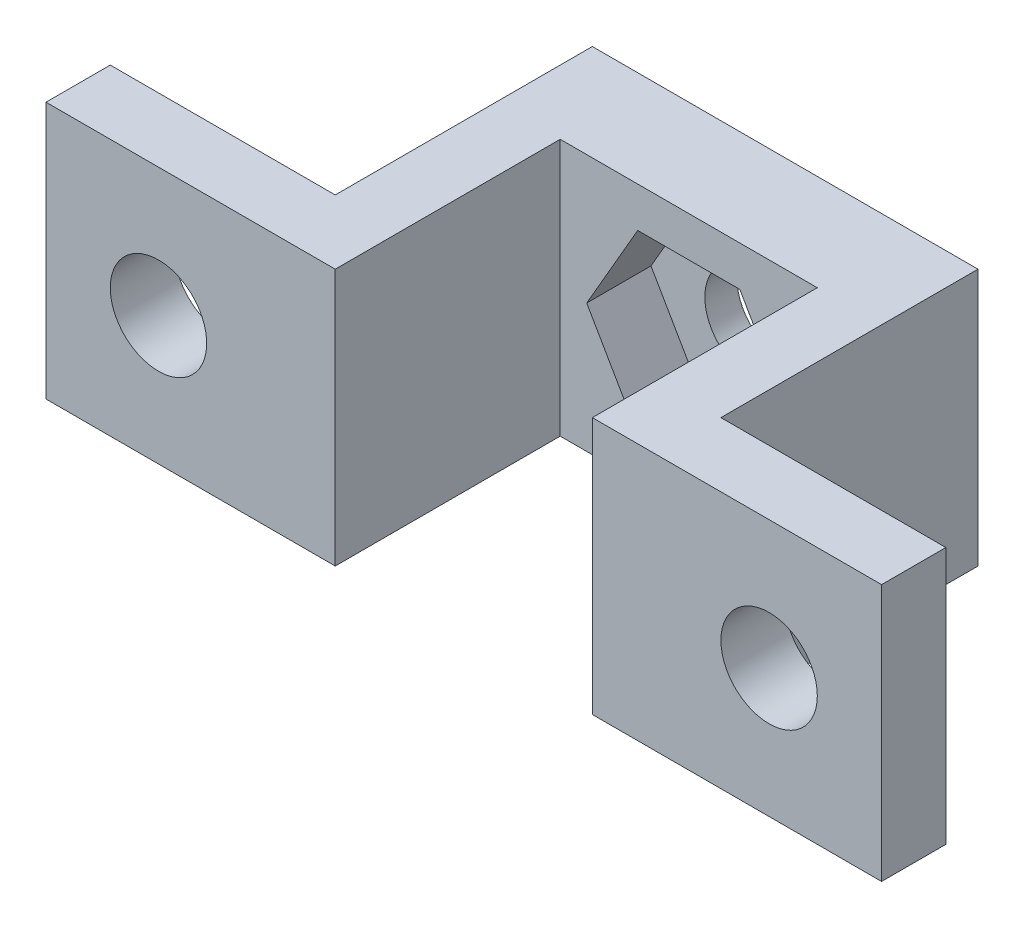
ISO-10303-21;
HEADER;
FILE_DESCRIPTION(('STEP AP214'),'2;1');
FILE_NAME('part.step','',(''),(''),'','','');
FILE_SCHEMA(('AUTOMOTIVE_DESIGN { 1 0 10303 214 1 1 1 1 }'));
ENDSEC;
DATA;
#1=APPLICATION_CONTEXT('core data for automotive mechanical design processes');
#2=APPLICATION_PROTOCOL_DEFINITION('international standard','automotive_design',2000,#1);
#3=PRODUCT_CONTEXT('',#1,'mechanical');
#4=PRODUCT('Part','Part','',(#3));
#5=PRODUCT_RELATED_PRODUCT_CATEGORY('part','',(#4));
#6=PRODUCT_DEFINITION_FORMATION('','',#4);
#7=PRODUCT_DEFINITION_CONTEXT('part definition',#1,'design');
#8=PRODUCT_DEFINITION('design','',#6,#7);
#9=PRODUCT_DEFINITION_SHAPE('','',#8);
#10=(LENGTH_UNIT() NAMED_UNIT(*) SI_UNIT(.MILLI.,.METRE.));
#11=(NAMED_UNIT(*) PLANE_ANGLE_UNIT() SI_UNIT($,.RADIAN.));
#12=(NAMED_UNIT(*) SI_UNIT($,.STERADIAN.) SOLID_ANGLE_UNIT());
#13=UNCERTAINTY_MEASURE_WITH_UNIT(LENGTH_MEASURE(1.E-05),#10,'distance_accuracy_value','');
#14=(GEOMETRIC_REPRESENTATION_CONTEXT(3) GLOBAL_UNCERTAINTY_ASSIGNED_CONTEXT((#13)) GLOBAL_UNIT_ASSIGNED_CONTEXT((#10,
#11,#12)) REPRESENTATION_CONTEXT('',''));
#15=CARTESIAN_POINT('',(0.,0.,0.));
#16=DIRECTION('',(0.,0.,1.));
#17=DIRECTION('',(1.,0.,0.));
#18=AXIS2_PLACEMENT_3D('',#15,#16,#17);
#19=CARTESIAN_POINT('',(-2.,8.,0.));
#20=DIRECTION('',(-1.,0.,0.));
#21=DIRECTION('',(0.,-1.,0.));
#22=AXIS2_PLACEMENT_3D('',#19,#20,#21);
#23=PLANE('',#22);
#24=DIRECTION('',(0.,0.,1.));
#25=VECTOR('',#24,1.);
#26=CARTESIAN_POINT('',(-2.,0.,0.));
#27=LINE('',#26,#25);
#28=CARTESIAN_POINT('',(-2.,0.,0.));
#29=VERTEX_POINT('',#28);
#30=CARTESIAN_POINT('',(-2.,0.,8.));
#31=VERTEX_POINT('',#30);
#32=EDGE_CURVE('E245',#29,#31,#27,.T.);
#33=ORIENTED_EDGE('',*,*,#32,.T.);
#34=DIRECTION('',(0.,1.,0.));
#35=VECTOR('',#34,1.);
#36=CARTESIAN_POINT('',(-2.,0.,8.));
#37=LINE('',#36,#35);
#38=CARTESIAN_POINT('',(-2.,8.,8.));
#39=VERTEX_POINT('',#38);
#40=EDGE_CURVE('E207',#31,#39,#37,.T.);
#41=ORIENTED_EDGE('',*,*,#40,.T.);
#42=DIRECTION('',(0.,0.,1.));
#43=VECTOR('',#42,1.);
#44=CARTESIAN_POINT('',(-2.,8.,0.));
#45=LINE('',#44,#43);
#46=CARTESIAN_POINT('',(-2.,8.,0.));
#47=VERTEX_POINT('',#46);
#48=EDGE_CURVE('E248',#47,#39,#45,.T.);
#49=ORIENTED_EDGE('',*,*,#48,.F.);
#50=DIRECTION('',(0.,-1.,0.));
#51=VECTOR('',#50,1.);
#52=CARTESIAN_POINT('',(-2.,8.,0.));
#53=LINE('',#52,#51);
#54=EDGE_CURVE('E238',#47,#29,#53,.T.);
#55=ORIENTED_EDGE('',*,*,#54,.T.);
#56=EDGE_LOOP('',(#33,#41,#49,#55));
#57=FACE_BOUND('',#56,.T.);
#58=ADVANCED_FACE('F35',(#57),#23,.T.);
#59=CARTESIAN_POINT('',(0.,0.,3.));
#60=DIRECTION('',(0.,1.,0.));
#61=DIRECTION('',(0.,0.,1.));
#62=AXIS2_PLACEMENT_3D('',#59,#60,#61);
#63=PLANE('',#62);
#64=DIRECTION('',(1.,0.,0.));
#65=VECTOR('',#64,1.);
#66=CARTESIAN_POINT('',(0.,0.,0.));
#67=LINE('',#66,#65);
#68=CARTESIAN_POINT('',(10.,0.,0.));
#69=VERTEX_POINT('',#68);
#70=EDGE_CURVE('E289',#29,#69,#67,.T.);
#71=ORIENTED_EDGE('',*,*,#70,.T.);
#72=DIRECTION('',(0.,0.,1.));
#73=VECTOR('',#72,1.);
#74=CARTESIAN_POINT('',(10.,0.,0.));
#75=LINE('',#74,#73);
#76=CARTESIAN_POINT('',(10.,0.,8.));
#77=VERTEX_POINT('',#76);
#78=EDGE_CURVE('E228',#69,#77,#75,.T.);
#79=ORIENTED_EDGE('',*,*,#78,.T.);
#80=DIRECTION('',(-1.,0.,0.));
#81=VECTOR('',#80,1.);
#82=CARTESIAN_POINT('',(10.,0.,8.));
#83=LINE('',#82,#81);
#84=CARTESIAN_POINT('',(17.,0.,8.));
#85=VERTEX_POINT('',#84);
#86=EDGE_CURVE('E185',#85,#77,#83,.T.);
#87=ORIENTED_EDGE('',*,*,#86,.F.);
#88=DIRECTION('',(0.,0.,-1.));
#89=VECTOR('',#88,1.);
#90=CARTESIAN_POINT('',(17.,0.,10.));
#91=LINE('',#90,#89);
#92=CARTESIAN_POINT('',(17.,0.,10.));
#93=VERTEX_POINT('',#92);
#94=EDGE_CURVE('E180',#93,#85,#91,.T.);
#95=ORIENTED_EDGE('',*,*,#94,.F.);
#96=DIRECTION('',(1.,0.,0.));
#97=VECTOR('',#96,1.);
#98=CARTESIAN_POINT('',(8.,0.,10.));
#99=LINE('',#98,#97);
#100=CARTESIAN_POINT('',(8.,0.,10.));
#101=VERTEX_POINT('',#100);
#102=EDGE_CURVE('E164',#101,#93,#99,.T.);
#103=ORIENTED_EDGE('',*,*,#102,.F.);
#104=DIRECTION('',(0.,0.,1.));
#105=VECTOR('',#104,1.);
#106=CARTESIAN_POINT('',(8.,0.,0.));
#107=LINE('',#106,#105);
#108=CARTESIAN_POINT('',(8.,0.,3.));
#109=VERTEX_POINT('',#108);
#110=EDGE_CURVE('E222',#109,#101,#107,.T.);
#111=ORIENTED_EDGE('',*,*,#110,.F.);
#112=DIRECTION('',(1.,0.,0.));
#113=VECTOR('',#112,1.);
#114=CARTESIAN_POINT('',(0.,0.,3.));
#115=LINE('',#114,#113);
#116=CARTESIAN_POINT('',(0.,0.,3.));
#117=VERTEX_POINT('',#116);
#118=EDGE_CURVE('E303',#117,#109,#115,.T.);
#119=ORIENTED_EDGE('',*,*,#118,.F.);
#120=DIRECTION('',(0.,0.,1.));
#121=VECTOR('',#120,1.);
#122=CARTESIAN_POINT('',(0.,0.,0.));
#123=LINE('',#122,#121);
#124=CARTESIAN_POINT('',(0.,0.,10.));
#125=VERTEX_POINT('',#124);
#126=EDGE_CURVE('E242',#117,#125,#123,.T.);
#127=ORIENTED_EDGE('',*,*,#126,.T.);
#128=DIRECTION('',(1.,0.,0.));
#129=VECTOR('',#128,1.);
#130=CARTESIAN_POINT('',(0.,0.,10.));
#131=LINE('',#130,#129);
#132=CARTESIAN_POINT('',(-9.,0.,10.));
#133=VERTEX_POINT('',#132);
#134=EDGE_CURVE('E235',#133,#125,#131,.T.);
#135=ORIENTED_EDGE('',*,*,#134,.F.);
#136=DIRECTION('',(0.,0.,1.));
#137=VECTOR('',#136,1.);
#138=CARTESIAN_POINT('',(-9.,0.,10.));
#139=LINE('',#138,#137);
#140=CARTESIAN_POINT('',(-9.,0.,8.));
#141=VERTEX_POINT('',#140);
#142=EDGE_CURVE('E203',#141,#133,#139,.T.);
#143=ORIENTED_EDGE('',*,*,#142,.F.);
#144=DIRECTION('',(-1.,0.,0.));
#145=VECTOR('',#144,1.);
#146=CARTESIAN_POINT('',(-2.,0.,8.));
#147=LINE('',#146,#145);
#148=EDGE_CURVE('E200',#31,#141,#147,.T.);
#149=ORIENTED_EDGE('',*,*,#148,.F.);
#150=ORIENTED_EDGE('',*,*,#32,.F.);
#151=EDGE_LOOP('',(#71,#79,#87,#95,#103,#111,#119,#127,#135,#143,#149,#150));
#152=FACE_BOUND('',#151,.T.);
#153=ADVANCED_FACE('F37',(#152),#63,.F.);
#154=CARTESIAN_POINT('',(0.,8.,3.));
#155=DIRECTION('',(0.,-1.,0.));
#156=DIRECTION('',(0.,0.,-1.));
#157=AXIS2_PLACEMENT_3D('',#154,#155,#156);
#158=PLANE('',#157);
#159=DIRECTION('',(-1.,0.,0.));
#160=VECTOR('',#159,1.);
#161=CARTESIAN_POINT('',(0.,8.,0.));
#162=LINE('',#161,#160);
#163=CARTESIAN_POINT('',(10.,8.,0.));
#164=VERTEX_POINT('',#163);
#165=EDGE_CURVE('E39',#164,#47,#162,.T.);
#166=ORIENTED_EDGE('',*,*,#165,.T.);
#167=ORIENTED_EDGE('',*,*,#48,.T.);
#168=DIRECTION('',(-1.,0.,0.));
#169=VECTOR('',#168,1.);
#170=CARTESIAN_POINT('',(-2.,8.,8.));
#171=LINE('',#170,#169);
#172=CARTESIAN_POINT('',(-9.,8.,8.));
#173=VERTEX_POINT('',#172);
#174=EDGE_CURVE('E60',#39,#173,#171,.T.);
#175=ORIENTED_EDGE('',*,*,#174,.T.);
#176=DIRECTION('',(0.,0.,1.));
#177=VECTOR('',#176,1.);
#178=CARTESIAN_POINT('',(-9.,8.,10.));
#179=LINE('',#178,#177);
#180=CARTESIAN_POINT('',(-9.,8.,10.));
#181=VERTEX_POINT('',#180);
#182=EDGE_CURVE('E204',#173,#181,#179,.T.);
#183=ORIENTED_EDGE('',*,*,#182,.T.);
#184=DIRECTION('',(-1.,0.,0.));
#185=VECTOR('',#184,1.);
#186=CARTESIAN_POINT('',(0.,8.,10.));
#187=LINE('',#186,#185);
#188=CARTESIAN_POINT('',(0.,8.,10.));
#189=VERTEX_POINT('',#188);
#190=EDGE_CURVE('E233',#189,#181,#187,.T.);
#191=ORIENTED_EDGE('',*,*,#190,.F.);
#192=DIRECTION('',(0.,0.,1.));
#193=VECTOR('',#192,1.);
#194=CARTESIAN_POINT('',(0.,8.,0.));
#195=LINE('',#194,#193);
#196=CARTESIAN_POINT('',(0.,8.,3.));
#197=VERTEX_POINT('',#196);
#198=EDGE_CURVE('E241',#197,#189,#195,.T.);
#199=ORIENTED_EDGE('',*,*,#198,.F.);
#200=DIRECTION('',(-1.,0.,0.));
#201=VECTOR('',#200,1.);
#202=CARTESIAN_POINT('',(0.,8.,3.));
#203=LINE('',#202,#201);
#204=CARTESIAN_POINT('',(8.,8.,3.));
#205=VERTEX_POINT('',#204);
#206=EDGE_CURVE('E11',#205,#197,#203,.T.);
#207=ORIENTED_EDGE('',*,*,#206,.F.);
#208=DIRECTION('',(0.,0.,1.));
#209=VECTOR('',#208,1.);
#210=CARTESIAN_POINT('',(8.,8.,0.));
#211=LINE('',#210,#209);
#212=CARTESIAN_POINT('',(8.,8.,10.));
#213=VERTEX_POINT('',#212);
#214=EDGE_CURVE('E223',#205,#213,#211,.T.);
#215=ORIENTED_EDGE('',*,*,#214,.T.);
#216=DIRECTION('',(-1.,0.,0.));
#217=VECTOR('',#216,1.);
#218=CARTESIAN_POINT('',(8.,8.,10.));
#219=LINE('',#218,#217);
#220=CARTESIAN_POINT('',(17.,8.,10.));
#221=VERTEX_POINT('',#220);
#222=EDGE_CURVE('E175',#221,#213,#219,.T.);
#223=ORIENTED_EDGE('',*,*,#222,.F.);
#224=DIRECTION('',(0.,0.,-1.));
#225=VECTOR('',#224,1.);
#226=CARTESIAN_POINT('',(17.,8.,10.));
#227=LINE('',#226,#225);
#228=CARTESIAN_POINT('',(17.,8.,8.));
#229=VERTEX_POINT('',#228);
#230=EDGE_CURVE('E183',#221,#229,#227,.T.);
#231=ORIENTED_EDGE('',*,*,#230,.T.);
#232=DIRECTION('',(-1.,0.,0.));
#233=VECTOR('',#232,1.);
#234=CARTESIAN_POINT('',(10.,8.,8.));
#235=LINE('',#234,#233);
#236=CARTESIAN_POINT('',(10.,8.,8.));
#237=VERTEX_POINT('',#236);
#238=EDGE_CURVE('E188',#229,#237,#235,.T.);
#239=ORIENTED_EDGE('',*,*,#238,.T.);
#240=DIRECTION('',(0.,0.,1.));
#241=VECTOR('',#240,1.);
#242=CARTESIAN_POINT('',(10.,8.,0.));
#243=LINE('',#242,#241);
#244=EDGE_CURVE('E226',#164,#237,#243,.T.);
#245=ORIENTED_EDGE('',*,*,#244,.F.);
#246=EDGE_LOOP('',(#166,#167,#175,#183,#191,#199,#207,#215,#223,#231,#239,#245));
#247=FACE_BOUND('',#246,.T.);
#248=ADVANCED_FACE('F311',(#247),#158,.F.);
#249=CARTESIAN_POINT('',(0.,0.,3.));
#250=DIRECTION('',(0.,0.,-1.));
#251=DIRECTION('',(-1.,0.,0.));
#252=AXIS2_PLACEMENT_3D('',#249,#250,#251);
#253=PLANE('',#252);
#254=DIRECTION('',(-1.,0.,0.));
#255=VECTOR('',#254,1.);
#256=CARTESIAN_POINT('',(5.58771324027147,6.75,3.));
#257=LINE('',#256,#255);
#258=CARTESIAN_POINT('',(5.58771324027147,6.75,3.));
#259=VERTEX_POINT('',#258);
#260=CARTESIAN_POINT('',(2.41228675972853,6.75,3.));
#261=VERTEX_POINT('',#260);
#262=EDGE_CURVE('E273',#259,#261,#257,.T.);
#263=ORIENTED_EDGE('',*,*,#262,.F.);
#264=DIRECTION('',(-0.5,0.866025403784438,0.));
#265=VECTOR('',#264,1.);
#266=CARTESIAN_POINT('',(7.17542648054294,4.,3.));
#267=LINE('',#266,#265);
#268=CARTESIAN_POINT('',(7.17542648054294,4.,3.));
#269=VERTEX_POINT('',#268);
#270=EDGE_CURVE('E244',#269,#259,#267,.T.);
#271=ORIENTED_EDGE('',*,*,#270,.F.);
#272=DIRECTION('',(0.5,0.866025403784439,0.));
#273=VECTOR('',#272,1.);
#274=CARTESIAN_POINT('',(5.58771324027147,1.25,3.));
#275=LINE('',#274,#273);
#276=CARTESIAN_POINT('',(5.58771324027147,1.25,3.));
#277=VERTEX_POINT('',#276);
#278=EDGE_CURVE('E256',#277,#269,#275,.T.);
#279=ORIENTED_EDGE('',*,*,#278,.F.);
#280=DIRECTION('',(1.,0.,0.));
#281=VECTOR('',#280,1.);
#282=CARTESIAN_POINT('',(2.41228675972853,1.25,3.));
#283=LINE('',#282,#281);
#284=CARTESIAN_POINT('',(2.41228675972853,1.25,3.));
#285=VERTEX_POINT('',#284);
#286=EDGE_CURVE('E282',#285,#277,#283,.T.);
#287=ORIENTED_EDGE('',*,*,#286,.F.);
#288=DIRECTION('',(0.5,-0.866025403784438,0.));
#289=VECTOR('',#288,1.);
#290=CARTESIAN_POINT('',(0.824573519457059,4.,3.));
#291=LINE('',#290,#289);
#292=CARTESIAN_POINT('',(0.824573519457059,4.,3.));
#293=VERTEX_POINT('',#292);
#294=EDGE_CURVE('E279',#293,#285,#291,.T.);
#295=ORIENTED_EDGE('',*,*,#294,.F.);
#296=DIRECTION('',(-0.5,-0.866025403784439,0.));
#297=VECTOR('',#296,1.);
#298=CARTESIAN_POINT('',(2.41228675972853,6.75,3.));
#299=LINE('',#298,#297);
#300=EDGE_CURVE('E276',#261,#293,#299,.T.);
#301=ORIENTED_EDGE('',*,*,#300,.F.);
#302=EDGE_LOOP('',(#263,#271,#279,#287,#295,#301));
#303=FACE_BOUND('',#302,.T.);
#304=DIRECTION('',(0.,-1.,0.));
#305=VECTOR('',#304,1.);
#306=CARTESIAN_POINT('',(0.,0.,3.));
#307=LINE('',#306,#305);
#308=EDGE_CURVE('E300',#197,#117,#307,.T.);
#309=ORIENTED_EDGE('',*,*,#308,.T.);
#310=ORIENTED_EDGE('',*,*,#118,.T.);
#311=DIRECTION('',(0.,1.,0.));
#312=VECTOR('',#311,1.);
#313=CARTESIAN_POINT('',(8.,0.,3.));
#314=LINE('',#313,#312);
#315=EDGE_CURVE('E44',#109,#205,#314,.T.);
#316=ORIENTED_EDGE('',*,*,#315,.T.);
#317=ORIENTED_EDGE('',*,*,#206,.T.);
#318=EDGE_LOOP('',(#309,#310,#316,#317));
#319=FACE_BOUND('',#318,.T.);
#320=ADVANCED_FACE('F334',(#303,#319),#253,.F.);
#321=CARTESIAN_POINT('',(0.,0.,0.));
#322=DIRECTION('',(0.,0.,-1.));
#323=DIRECTION('',(-1.,0.,0.));
#324=AXIS2_PLACEMENT_3D('',#321,#322,#323);
#325=PLANE('',#324);
#326=CARTESIAN_POINT('',(4.,4.,0.));
#327=DIRECTION('',(0.,0.,-1.));
#328=DIRECTION('',(-1.,0.,0.));
#329=AXIS2_PLACEMENT_3D('',#326,#327,#328);
#330=CIRCLE('',#329,1.5);
#331=CARTESIAN_POINT('',(2.5,4.,0.));
#332=VERTEX_POINT('',#331);
#333=EDGE_CURVE('E194',#332,#332,#330,.T.);
#334=ORIENTED_EDGE('',*,*,#333,.F.);
#335=EDGE_LOOP('',(#334));
#336=FACE_BOUND('',#335,.T.);
#337=ORIENTED_EDGE('',*,*,#70,.F.);
#338=ORIENTED_EDGE('',*,*,#54,.F.);
#339=ORIENTED_EDGE('',*,*,#165,.F.);
#340=DIRECTION('',(0.,1.,0.));
#341=VECTOR('',#340,1.);
#342=CARTESIAN_POINT('',(10.,8.,0.));
#343=LINE('',#342,#341);
#344=EDGE_CURVE('E219',#69,#164,#343,.T.);
#345=ORIENTED_EDGE('',*,*,#344,.F.);
#346=EDGE_LOOP('',(#337,#338,#339,#345));
#347=FACE_BOUND('',#346,.T.);
#348=ADVANCED_FACE('F316',(#336,#347),#325,.T.);
#349=CARTESIAN_POINT('',(7.17542648054294,4.,1.));
#350=DIRECTION('',(0.866025403784438,0.5,0.));
#351=DIRECTION('',(-0.5,0.866025403784439,0.));
#352=AXIS2_PLACEMENT_3D('',#349,#350,#351);
#353=PLANE('',#352);
#354=ORIENTED_EDGE('',*,*,#270,.T.);
#355=DIRECTION('',(0.,0.,1.));
#356=VECTOR('',#355,1.);
#357=CARTESIAN_POINT('',(5.58771324027147,6.75,1.));
#358=LINE('',#357,#356);
#359=CARTESIAN_POINT('',(5.58771324027147,6.75,1.));
#360=VERTEX_POINT('',#359);
#361=EDGE_CURVE('E271',#360,#259,#358,.T.);
#362=ORIENTED_EDGE('',*,*,#361,.F.);
#363=DIRECTION('',(-0.5,0.866025403784438,0.));
#364=VECTOR('',#363,1.);
#365=CARTESIAN_POINT('',(7.17542648054294,4.,1.));
#366=LINE('',#365,#364);
#367=CARTESIAN_POINT('',(7.17542648054294,4.,1.));
#368=VERTEX_POINT('',#367);
#369=EDGE_CURVE('E252',#368,#360,#366,.T.);
#370=ORIENTED_EDGE('',*,*,#369,.F.);
#371=DIRECTION('',(0.,0.,1.));
#372=VECTOR('',#371,1.);
#373=CARTESIAN_POINT('',(7.17542648054294,4.,1.));
#374=LINE('',#373,#372);
#375=EDGE_CURVE('E287',#368,#269,#374,.T.);
#376=ORIENTED_EDGE('',*,*,#375,.T.);
#377=EDGE_LOOP('',(#354,#362,#370,#376));
#378=FACE_BOUND('',#377,.T.);
#379=ADVANCED_FACE('F364',(#378),#353,.F.);
#380=CARTESIAN_POINT('',(5.58771324027147,1.25,1.));
#381=DIRECTION('',(0.866025403784439,-0.5,0.));
#382=DIRECTION('',(0.5,0.866025403784439,0.));
#383=AXIS2_PLACEMENT_3D('',#380,#381,#382);
#384=PLANE('',#383);
#385=ORIENTED_EDGE('',*,*,#278,.T.);
#386=ORIENTED_EDGE('',*,*,#375,.F.);
#387=DIRECTION('',(0.5,0.866025403784439,0.));
#388=VECTOR('',#387,1.);
#389=CARTESIAN_POINT('',(5.58771324027147,1.25,1.));
#390=LINE('',#389,#388);
#391=CARTESIAN_POINT('',(5.58771324027147,1.25,1.));
#392=VERTEX_POINT('',#391);
#393=EDGE_CURVE('E268',#392,#368,#390,.T.);
#394=ORIENTED_EDGE('',*,*,#393,.F.);
#395=DIRECTION('',(0.,0.,1.));
#396=VECTOR('',#395,1.);
#397=CARTESIAN_POINT('',(5.58771324027147,1.25,1.));
#398=LINE('',#397,#396);
#399=EDGE_CURVE('E290',#392,#277,#398,.T.);
#400=ORIENTED_EDGE('',*,*,#399,.T.);
#401=EDGE_LOOP('',(#385,#386,#394,#400));
#402=FACE_BOUND('',#401,.T.);
#403=ADVANCED_FACE('F360',(#402),#384,.F.);
#404=CARTESIAN_POINT('',(2.41228675972853,1.25,1.));
#405=DIRECTION('',(0.,-1.,0.));
#406=DIRECTION('',(1.,0.,0.));
#407=AXIS2_PLACEMENT_3D('',#404,#405,#406);
#408=PLANE('',#407);
#409=ORIENTED_EDGE('',*,*,#286,.T.);
#410=ORIENTED_EDGE('',*,*,#399,.F.);
#411=DIRECTION('',(1.,0.,0.));
#412=VECTOR('',#411,1.);
#413=CARTESIAN_POINT('',(2.41228675972853,1.25,1.));
#414=LINE('',#413,#412);
#415=CARTESIAN_POINT('',(2.41228675972853,1.25,1.));
#416=VERTEX_POINT('',#415);
#417=EDGE_CURVE('E265',#416,#392,#414,.T.);
#418=ORIENTED_EDGE('',*,*,#417,.F.);
#419=DIRECTION('',(0.,0.,1.));
#420=VECTOR('',#419,1.);
#421=CARTESIAN_POINT('',(2.41228675972853,1.25,1.));
#422=LINE('',#421,#420);
#423=EDGE_CURVE('E292',#416,#285,#422,.T.);
#424=ORIENTED_EDGE('',*,*,#423,.T.);
#425=EDGE_LOOP('',(#409,#410,#418,#424));
#426=FACE_BOUND('',#425,.T.);
#427=ADVANCED_FACE('F363',(#426),#408,.F.);
#428=CARTESIAN_POINT('',(0.824573519457059,4.,1.));
#429=DIRECTION('',(-0.866025403784438,-0.5,0.));
#430=DIRECTION('',(0.5,-0.866025403784439,0.));
#431=AXIS2_PLACEMENT_3D('',#428,#429,#430);
#432=PLANE('',#431);
#433=ORIENTED_EDGE('',*,*,#294,.T.);
#434=ORIENTED_EDGE('',*,*,#423,.F.);
#435=DIRECTION('',(0.5,-0.866025403784438,0.));
#436=VECTOR('',#435,1.);
#437=CARTESIAN_POINT('',(0.824573519457059,4.,1.));
#438=LINE('',#437,#436);
#439=CARTESIAN_POINT('',(0.824573519457059,4.,1.));
#440=VERTEX_POINT('',#439);
#441=EDGE_CURVE('E262',#440,#416,#438,.T.);
#442=ORIENTED_EDGE('',*,*,#441,.F.);
#443=DIRECTION('',(0.,0.,1.));
#444=VECTOR('',#443,1.);
#445=CARTESIAN_POINT('',(0.824573519457059,4.,1.));
#446=LINE('',#445,#444);
#447=EDGE_CURVE('E294',#440,#293,#446,.T.);
#448=ORIENTED_EDGE('',*,*,#447,.T.);
#449=EDGE_LOOP('',(#433,#434,#442,#448));
#450=FACE_BOUND('',#449,.T.);
#451=ADVANCED_FACE('F368',(#450),#432,.F.);
#452=CARTESIAN_POINT('',(2.41228675972853,6.75,1.));
#453=DIRECTION('',(-0.866025403784439,0.5,0.));
#454=DIRECTION('',(-0.5,-0.866025403784439,0.));
#455=AXIS2_PLACEMENT_3D('',#452,#453,#454);
#456=PLANE('',#455);
#457=ORIENTED_EDGE('',*,*,#300,.T.);
#458=ORIENTED_EDGE('',*,*,#447,.F.);
#459=DIRECTION('',(-0.5,-0.866025403784439,0.));
#460=VECTOR('',#459,1.);
#461=CARTESIAN_POINT('',(2.41228675972853,6.75,1.));
#462=LINE('',#461,#460);
#463=CARTESIAN_POINT('',(2.41228675972853,6.75,1.));
#464=VERTEX_POINT('',#463);
#465=EDGE_CURVE('E259',#464,#440,#462,.T.);
#466=ORIENTED_EDGE('',*,*,#465,.F.);
#467=DIRECTION('',(0.,0.,1.));
#468=VECTOR('',#467,1.);
#469=CARTESIAN_POINT('',(2.41228675972853,6.75,1.));
#470=LINE('',#469,#468);
#471=EDGE_CURVE('E296',#464,#261,#470,.T.);
#472=ORIENTED_EDGE('',*,*,#471,.T.);
#473=EDGE_LOOP('',(#457,#458,#466,#472));
#474=FACE_BOUND('',#473,.T.);
#475=ADVANCED_FACE('F372',(#474),#456,.F.);
#476=CARTESIAN_POINT('',(5.58771324027147,6.75,1.));
#477=DIRECTION('',(0.,1.,0.));
#478=DIRECTION('',(0.,0.,1.));
#479=AXIS2_PLACEMENT_3D('',#476,#477,#478);
#480=PLANE('',#479);
#481=ORIENTED_EDGE('',*,*,#262,.T.);
#482=ORIENTED_EDGE('',*,*,#471,.F.);
#483=DIRECTION('',(-1.,0.,0.));
#484=VECTOR('',#483,1.);
#485=CARTESIAN_POINT('',(5.58771324027147,6.75,1.));
#486=LINE('',#485,#484);
#487=EDGE_CURVE('E255',#360,#464,#486,.T.);
#488=ORIENTED_EDGE('',*,*,#487,.F.);
#489=ORIENTED_EDGE('',*,*,#361,.T.);
#490=EDGE_LOOP('',(#481,#482,#488,#489));
#491=FACE_BOUND('',#490,.T.);
#492=ADVANCED_FACE('F358',(#491),#480,.F.);
#493=CARTESIAN_POINT('',(0.,0.,1.));
#494=DIRECTION('',(0.,0.,1.));
#495=DIRECTION('',(1.,0.,0.));
#496=AXIS2_PLACEMENT_3D('',#493,#494,#495);
#497=PLANE('',#496);
#498=CARTESIAN_POINT('',(4.,4.,1.));
#499=DIRECTION('',(0.,0.,1.));
#500=DIRECTION('',(1.,0.,0.));
#501=AXIS2_PLACEMENT_3D('',#498,#499,#500);
#502=CIRCLE('',#501,1.5);
#503=CARTESIAN_POINT('',(5.5,4.,1.));
#504=VERTEX_POINT('',#503);
#505=EDGE_CURVE('E598',#504,#504,#502,.T.);
#506=ORIENTED_EDGE('',*,*,#505,.F.);
#507=EDGE_LOOP('',(#506));
#508=FACE_BOUND('',#507,.T.);
#509=ORIENTED_EDGE('',*,*,#369,.T.);
#510=ORIENTED_EDGE('',*,*,#487,.T.);
#511=ORIENTED_EDGE('',*,*,#465,.T.);
#512=ORIENTED_EDGE('',*,*,#441,.T.);
#513=ORIENTED_EDGE('',*,*,#417,.T.);
#514=ORIENTED_EDGE('',*,*,#393,.T.);
#515=EDGE_LOOP('',(#509,#510,#511,#512,#513,#514));
#516=FACE_BOUND('',#515,.T.);
#517=ADVANCED_FACE('F355',(#508,#516),#497,.T.);
#518=CARTESIAN_POINT('',(0.,8.,0.));
#519=DIRECTION('',(1.,0.,0.));
#520=DIRECTION('',(0.,1.,0.));
#521=AXIS2_PLACEMENT_3D('',#518,#519,#520);
#522=PLANE('',#521);
#523=ORIENTED_EDGE('',*,*,#308,.F.);
#524=ORIENTED_EDGE('',*,*,#198,.T.);
#525=DIRECTION('',(0.,1.,0.));
#526=VECTOR('',#525,1.);
#527=CARTESIAN_POINT('',(0.,8.,10.));
#528=LINE('',#527,#526);
#529=EDGE_CURVE('E225',#125,#189,#528,.T.);
#530=ORIENTED_EDGE('',*,*,#529,.F.);
#531=ORIENTED_EDGE('',*,*,#126,.F.);
#532=EDGE_LOOP('',(#523,#524,#530,#531));
#533=FACE_BOUND('',#532,.T.);
#534=ADVANCED_FACE('F331',(#533),#522,.T.);
#535=CARTESIAN_POINT('',(0.,0.,10.));
#536=DIRECTION('',(0.,0.,-1.));
#537=DIRECTION('',(-1.,0.,0.));
#538=AXIS2_PLACEMENT_3D('',#535,#536,#537);
#539=PLANE('',#538);
#540=CARTESIAN_POINT('',(-5.5,4.,10.));
#541=DIRECTION('',(0.,0.,-1.));
#542=DIRECTION('',(-1.,0.,0.));
#543=AXIS2_PLACEMENT_3D('',#540,#541,#542);
#544=CIRCLE('',#543,1.5);
#545=CARTESIAN_POINT('',(-7.,4.,10.));
#546=VERTEX_POINT('',#545);
#547=EDGE_CURVE('E606',#546,#546,#544,.T.);
#548=ORIENTED_EDGE('',*,*,#547,.T.);
#549=EDGE_LOOP('',(#548));
#550=FACE_BOUND('',#549,.T.);
#551=ORIENTED_EDGE('',*,*,#529,.T.);
#552=ORIENTED_EDGE('',*,*,#190,.T.);
#553=DIRECTION('',(0.,1.,0.));
#554=VECTOR('',#553,1.);
#555=CARTESIAN_POINT('',(-9.,0.,10.));
#556=LINE('',#555,#554);
#557=EDGE_CURVE('E211',#133,#181,#556,.T.);
#558=ORIENTED_EDGE('',*,*,#557,.F.);
#559=ORIENTED_EDGE('',*,*,#134,.T.);
#560=EDGE_LOOP('',(#551,#552,#558,#559));
#561=FACE_BOUND('',#560,.T.);
#562=ADVANCED_FACE('F329',(#550,#561),#539,.F.);
#563=CARTESIAN_POINT('',(8.,8.,0.));
#564=DIRECTION('',(-1.,0.,0.));
#565=DIRECTION('',(0.,-1.,0.));
#566=AXIS2_PLACEMENT_3D('',#563,#564,#565);
#567=PLANE('',#566);
#568=ORIENTED_EDGE('',*,*,#315,.F.);
#569=ORIENTED_EDGE('',*,*,#110,.T.);
#570=DIRECTION('',(0.,-1.,0.));
#571=VECTOR('',#570,1.);
#572=CARTESIAN_POINT('',(8.,8.,10.));
#573=LINE('',#572,#571);
#574=EDGE_CURVE('E171',#213,#101,#573,.T.);
#575=ORIENTED_EDGE('',*,*,#574,.F.);
#576=ORIENTED_EDGE('',*,*,#214,.F.);
#577=EDGE_LOOP('',(#568,#569,#575,#576));
#578=FACE_BOUND('',#577,.T.);
#579=ADVANCED_FACE('F336',(#578),#567,.T.);
#580=CARTESIAN_POINT('',(10.,8.,0.));
#581=DIRECTION('',(1.,0.,0.));
#582=DIRECTION('',(0.,1.,0.));
#583=AXIS2_PLACEMENT_3D('',#580,#581,#582);
#584=PLANE('',#583);
#585=DIRECTION('',(0.,1.,0.));
#586=VECTOR('',#585,1.);
#587=CARTESIAN_POINT('',(10.,0.,8.));
#588=LINE('',#587,#586);
#589=EDGE_CURVE('E52',#77,#237,#588,.T.);
#590=ORIENTED_EDGE('',*,*,#589,.F.);
#591=ORIENTED_EDGE('',*,*,#78,.F.);
#592=ORIENTED_EDGE('',*,*,#344,.T.);
#593=ORIENTED_EDGE('',*,*,#244,.T.);
#594=EDGE_LOOP('',(#590,#591,#592,#593));
#595=FACE_BOUND('',#594,.T.);
#596=ADVANCED_FACE('F338',(#595),#584,.T.);
#597=CARTESIAN_POINT('',(0.,0.,10.));
#598=DIRECTION('',(0.,0.,1.));
#599=DIRECTION('',(1.,0.,0.));
#600=AXIS2_PLACEMENT_3D('',#597,#598,#599);
#601=PLANE('',#600);
#602=CARTESIAN_POINT('',(13.5,4.,10.));
#603=DIRECTION('',(0.,0.,1.));
#604=DIRECTION('',(1.,0.,0.));
#605=AXIS2_PLACEMENT_3D('',#602,#603,#604);
#606=CIRCLE('',#605,1.5);
#607=CARTESIAN_POINT('',(15.,4.,10.));
#608=VERTEX_POINT('',#607);
#609=EDGE_CURVE('E599',#608,#608,#606,.T.);
#610=ORIENTED_EDGE('',*,*,#609,.F.);
#611=EDGE_LOOP('',(#610));
#612=FACE_BOUND('',#611,.T.);
#613=ORIENTED_EDGE('',*,*,#574,.T.);
#614=ORIENTED_EDGE('',*,*,#102,.T.);
#615=DIRECTION('',(0.,1.,0.));
#616=VECTOR('',#615,1.);
#617=CARTESIAN_POINT('',(17.,0.,10.));
#618=LINE('',#617,#616);
#619=EDGE_CURVE('E168',#93,#221,#618,.T.);
#620=ORIENTED_EDGE('',*,*,#619,.T.);
#621=ORIENTED_EDGE('',*,*,#222,.T.);
#622=EDGE_LOOP('',(#613,#614,#620,#621));
#623=FACE_BOUND('',#622,.T.);
#624=ADVANCED_FACE('F166',(#612,#623),#601,.T.);
#625=CARTESIAN_POINT('',(-9.,0.,10.));
#626=DIRECTION('',(-1.,0.,0.));
#627=DIRECTION('',(0.,0.,1.));
#628=AXIS2_PLACEMENT_3D('',#625,#626,#627);
#629=PLANE('',#628);
#630=ORIENTED_EDGE('',*,*,#182,.F.);
#631=DIRECTION('',(0.,1.,0.));
#632=VECTOR('',#631,1.);
#633=CARTESIAN_POINT('',(-9.,0.,8.));
#634=LINE('',#633,#632);
#635=EDGE_CURVE('E214',#141,#173,#634,.T.);
#636=ORIENTED_EDGE('',*,*,#635,.F.);
#637=ORIENTED_EDGE('',*,*,#142,.T.);
#638=ORIENTED_EDGE('',*,*,#557,.T.);
#639=EDGE_LOOP('',(#630,#636,#637,#638));
#640=FACE_BOUND('',#639,.T.);
#641=ADVANCED_FACE('F322',(#640),#629,.T.);
#642=CARTESIAN_POINT('',(-2.,0.,8.));
#643=DIRECTION('',(0.,0.,-1.));
#644=DIRECTION('',(-1.,0.,0.));
#645=AXIS2_PLACEMENT_3D('',#642,#643,#644);
#646=PLANE('',#645);
#647=CARTESIAN_POINT('',(-5.5,4.,8.));
#648=DIRECTION('',(0.,0.,-1.));
#649=DIRECTION('',(1.,0.,0.));
#650=AXIS2_PLACEMENT_3D('',#647,#648,#649);
#651=CIRCLE('',#650,1.5);
#652=CARTESIAN_POINT('',(-4.,4.,8.));
#653=VERTEX_POINT('',#652);
#654=EDGE_CURVE('E609',#653,#653,#651,.T.);
#655=ORIENTED_EDGE('',*,*,#654,.F.);
#656=EDGE_LOOP('',(#655));
#657=FACE_BOUND('',#656,.T.);
#658=ORIENTED_EDGE('',*,*,#174,.F.);
#659=ORIENTED_EDGE('',*,*,#40,.F.);
#660=ORIENTED_EDGE('',*,*,#148,.T.);
#661=ORIENTED_EDGE('',*,*,#635,.T.);
#662=EDGE_LOOP('',(#658,#659,#660,#661));
#663=FACE_BOUND('',#662,.T.);
#664=ADVANCED_FACE('F319',(#657,#663),#646,.T.);
#665=CARTESIAN_POINT('',(10.,0.,8.));
#666=DIRECTION('',(0.,0.,-1.));
#667=DIRECTION('',(-1.,0.,0.));
#668=AXIS2_PLACEMENT_3D('',#665,#666,#667);
#669=PLANE('',#668);
#670=CARTESIAN_POINT('',(13.5,4.,8.));
#671=DIRECTION('',(0.,0.,-1.));
#672=DIRECTION('',(-1.,0.,0.));
#673=AXIS2_PLACEMENT_3D('',#670,#671,#672);
#674=CIRCLE('',#673,1.5);
#675=CARTESIAN_POINT('',(12.,4.,8.));
#676=VERTEX_POINT('',#675);
#677=EDGE_CURVE('E601',#676,#676,#674,.T.);
#678=ORIENTED_EDGE('',*,*,#677,.F.);
#679=EDGE_LOOP('',(#678));
#680=FACE_BOUND('',#679,.T.);
#681=ORIENTED_EDGE('',*,*,#238,.F.);
#682=DIRECTION('',(0.,1.,0.));
#683=VECTOR('',#682,1.);
#684=CARTESIAN_POINT('',(17.,0.,8.));
#685=LINE('',#684,#683);
#686=EDGE_CURVE('E184',#85,#229,#685,.T.);
#687=ORIENTED_EDGE('',*,*,#686,.F.);
#688=ORIENTED_EDGE('',*,*,#86,.T.);
#689=ORIENTED_EDGE('',*,*,#589,.T.);
#690=EDGE_LOOP('',(#681,#687,#688,#689));
#691=FACE_BOUND('',#690,.T.);
#692=ADVANCED_FACE('F466',(#680,#691),#669,.T.);
#693=CARTESIAN_POINT('',(17.,0.,10.));
#694=DIRECTION('',(1.,0.,0.));
#695=DIRECTION('',(0.,0.,-1.));
#696=AXIS2_PLACEMENT_3D('',#693,#694,#695);
#697=PLANE('',#696);
#698=ORIENTED_EDGE('',*,*,#230,.F.);
#699=ORIENTED_EDGE('',*,*,#619,.F.);
#700=ORIENTED_EDGE('',*,*,#94,.T.);
#701=ORIENTED_EDGE('',*,*,#686,.T.);
#702=EDGE_LOOP('',(#698,#699,#700,#701));
#703=FACE_BOUND('',#702,.T.);
#704=ADVANCED_FACE('F179',(#703),#697,.T.);
#705=CARTESIAN_POINT('',(4.,4.,-6.));
#706=DIRECTION('',(0.,0.,1.));
#707=DIRECTION('',(1.,0.,0.));
#708=AXIS2_PLACEMENT_3D('',#705,#706,#707);
#709=CYLINDRICAL_SURFACE('',#708,1.5);
#710=ORIENTED_EDGE('',*,*,#333,.T.);
#711=EDGE_LOOP('',(#710));
#712=FACE_BOUND('',#711,.T.);
#713=ORIENTED_EDGE('',*,*,#505,.T.);
#714=EDGE_LOOP('',(#713));
#715=FACE_BOUND('',#714,.T.);
#716=ADVANCED_FACE('F447',(#712,#715),#709,.F.);
#717=CARTESIAN_POINT('',(13.5,4.,15.));
#718=DIRECTION('',(0.,0.,-1.));
#719=DIRECTION('',(-1.,0.,0.));
#720=AXIS2_PLACEMENT_3D('',#717,#718,#719);
#721=CYLINDRICAL_SURFACE('',#720,1.5);
#722=ORIENTED_EDGE('',*,*,#609,.T.);
#723=EDGE_LOOP('',(#722));
#724=FACE_BOUND('',#723,.T.);
#725=ORIENTED_EDGE('',*,*,#677,.T.);
#726=EDGE_LOOP('',(#725));
#727=FACE_BOUND('',#726,.T.);
#728=ADVANCED_FACE('F483',(#724,#727),#721,.F.);
#729=CARTESIAN_POINT('',(-5.5,4.,15.));
#730=DIRECTION('',(0.,0.,-1.));
#731=DIRECTION('',(-1.,0.,0.));
#732=AXIS2_PLACEMENT_3D('',#729,#730,#731);
#733=CYLINDRICAL_SURFACE('',#732,1.5);
#734=ORIENTED_EDGE('',*,*,#654,.T.);
#735=EDGE_LOOP('',(#734));
#736=FACE_BOUND('',#735,.T.);
#737=ORIENTED_EDGE('',*,*,#547,.F.);
#738=EDGE_LOOP('',(#737));
#739=FACE_BOUND('',#738,.T.);
#740=ADVANCED_FACE('F488',(#736,#739),#733,.F.);
#741=CLOSED_SHELL('',(#58,#153,#248,#320,#348,#379,#403,#427,#451,#475,#492,#517,#534,#562,#579,
#596,#624,#641,#664,#692,#704,#716,#728,#740));
#742=MANIFOLD_SOLID_BREP('B2',#741);
#743=ADVANCED_BREP_SHAPE_REPRESENTATION('',(#18,#742),#14);
#744=SHAPE_DEFINITION_REPRESENTATION(#9,#743);
ENDSEC;
END-ISO-10303-21;
